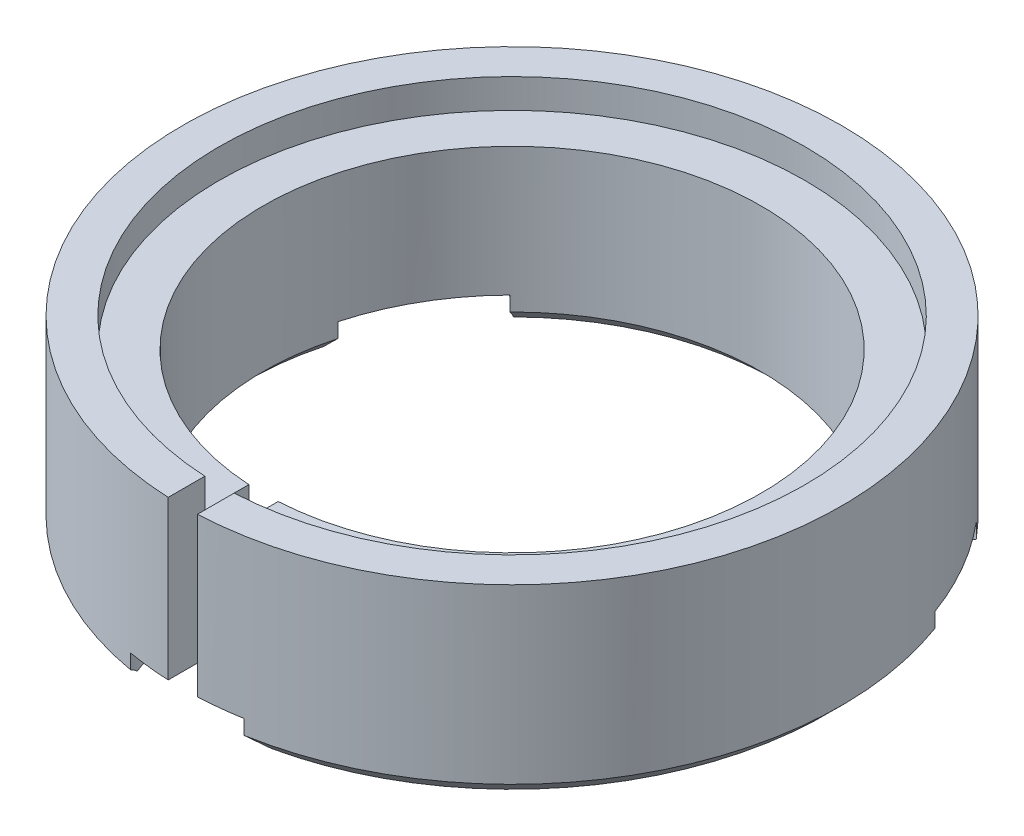
ISO-10303-21;
HEADER;
FILE_DESCRIPTION(('STEP AP214'),'2;1');
FILE_NAME('part.step','',(''),(''),'','','');
FILE_SCHEMA(('AUTOMOTIVE_DESIGN { 1 0 10303 214 1 1 1 1 }'));
ENDSEC;
DATA;
#1=APPLICATION_CONTEXT('core data for automotive mechanical design processes');
#2=APPLICATION_PROTOCOL_DEFINITION('international standard','automotive_design',2000,#1);
#3=PRODUCT_CONTEXT('',#1,'mechanical');
#4=PRODUCT('Part','Part','',(#3));
#5=PRODUCT_RELATED_PRODUCT_CATEGORY('part','',(#4));
#6=PRODUCT_DEFINITION_FORMATION('','',#4);
#7=PRODUCT_DEFINITION_CONTEXT('part definition',#1,'design');
#8=PRODUCT_DEFINITION('design','',#6,#7);
#9=PRODUCT_DEFINITION_SHAPE('','',#8);
#10=(LENGTH_UNIT() NAMED_UNIT(*) SI_UNIT(.MILLI.,.METRE.));
#11=(NAMED_UNIT(*) PLANE_ANGLE_UNIT() SI_UNIT($,.RADIAN.));
#12=(NAMED_UNIT(*) SI_UNIT($,.STERADIAN.) SOLID_ANGLE_UNIT());
#13=UNCERTAINTY_MEASURE_WITH_UNIT(LENGTH_MEASURE(1.E-05),#10,'distance_accuracy_value','');
#14=(GEOMETRIC_REPRESENTATION_CONTEXT(3) GLOBAL_UNCERTAINTY_ASSIGNED_CONTEXT((#13)) GLOBAL_UNIT_ASSIGNED_CONTEXT((#10,
#11,#12)) REPRESENTATION_CONTEXT('',''));
#15=CARTESIAN_POINT('',(0.,0.,0.));
#16=DIRECTION('',(0.,0.,1.));
#17=DIRECTION('',(1.,0.,0.));
#18=AXIS2_PLACEMENT_3D('',#15,#16,#17);
#19=CARTESIAN_POINT('',(0.,1.,9.5));
#20=DIRECTION('',(0.,-1.,0.));
#21=DIRECTION('',(0.,0.,-1.));
#22=AXIS2_PLACEMENT_3D('',#19,#20,#21);
#23=PLANE('',#22);
#24=DIRECTION('',(0.,0.,1.));
#25=VECTOR('',#24,1.);
#26=CARTESIAN_POINT('',(0.499999999999999,1.,9.5));
#27=LINE('',#26,#25);
#28=CARTESIAN_POINT('',(0.5,1.,8.48528137423857));
#29=VERTEX_POINT('',#28);
#30=CARTESIAN_POINT('',(0.499999999999999,1.,11.2388833964945));
#31=VERTEX_POINT('',#30);
#32=EDGE_CURVE('E11',#29,#31,#27,.T.);
#33=ORIENTED_EDGE('',*,*,#32,.F.);
#34=CARTESIAN_POINT('',(0.,1.,0.));
#35=DIRECTION('',(0.,-1.,0.));
#36=DIRECTION('',(0.,0.,-1.));
#37=AXIS2_PLACEMENT_3D('',#34,#35,#36);
#38=CIRCLE('',#37,8.5);
#39=CARTESIAN_POINT('',(2.14965532249711,1.,8.22368421052632));
#40=VERTEX_POINT('',#39);
#41=EDGE_CURVE('E227',#40,#29,#38,.T.);
#42=ORIENTED_EDGE('',*,*,#41,.F.);
#43=CARTESIAN_POINT('',(0.,1.,9.5));
#44=DIRECTION('',(0.,-1.,0.));
#45=DIRECTION('',(0.,0.,-1.));
#46=AXIS2_PLACEMENT_3D('',#43,#44,#45);
#47=CIRCLE('',#46,2.5);
#48=CARTESIAN_POINT('',(1.93559463098159,1.,11.0822368421053));
#49=VERTEX_POINT('',#48);
#50=EDGE_CURVE('E414',#40,#49,#47,.T.);
#51=ORIENTED_EDGE('',*,*,#50,.T.);
#52=CARTESIAN_POINT('',(0.,1.,0.));
#53=DIRECTION('',(0.,-1.,0.));
#54=DIRECTION('',(0.,0.,-1.));
#55=AXIS2_PLACEMENT_3D('',#52,#53,#54);
#56=CIRCLE('',#55,11.25);
#57=EDGE_CURVE('E209',#49,#31,#56,.T.);
#58=ORIENTED_EDGE('',*,*,#57,.T.);
#59=EDGE_LOOP('',(#33,#42,#51,#58));
#60=FACE_BOUND('',#59,.T.);
#61=ADVANCED_FACE('F41',(#60),#23,.T.);
#62=CARTESIAN_POINT('',(0.,0.,0.));
#63=DIRECTION('',(0.,1.,0.));
#64=DIRECTION('',(0.,0.,1.));
#65=AXIS2_PLACEMENT_3D('',#62,#63,#64);
#66=PLANE('',#65);
#67=CARTESIAN_POINT('',(0.,0.,0.));
#68=DIRECTION('',(0.,1.,0.));
#69=DIRECTION('',(0.,0.,1.));
#70=AXIS2_PLACEMENT_3D('',#67,#68,#69);
#71=CIRCLE('',#70,10.75);
#72=CARTESIAN_POINT('',(10.2410402028519,0.,-3.26857699367349));
#73=VERTEX_POINT('',#72);
#74=CARTESIAN_POINT('',(2.28984939067932,0.,10.5032894736842));
#75=VERTEX_POINT('',#74);
#76=EDGE_CURVE('E250',#73,#75,#71,.F.);
#77=ORIENTED_EDGE('',*,*,#76,.T.);
#78=CARTESIAN_POINT('',(0.,0.,9.5));
#79=DIRECTION('',(0.,-1.,0.));
#80=DIRECTION('',(0.,0.,-1.));
#81=AXIS2_PLACEMENT_3D('',#78,#79,#80);
#82=CIRCLE('',#81,2.5);
#83=CARTESIAN_POINT('',(2.36315203375196,0.,8.68421052631579));
#84=VERTEX_POINT('',#83);
#85=EDGE_CURVE('E415',#84,#75,#82,.T.);
#86=ORIENTED_EDGE('',*,*,#85,.F.);
#87=CARTESIAN_POINT('',(0.,0.,0.));
#88=DIRECTION('',(0.,1.,0.));
#89=DIRECTION('',(0.,0.,1.));
#90=AXIS2_PLACEMENT_3D('',#87,#88,#89);
#91=CIRCLE('',#90,9.);
#92=CARTESIAN_POINT('',(8.70232294447769,0.,-2.29555556892383));
#93=VERTEX_POINT('',#92);
#94=EDGE_CURVE('E259',#84,#93,#91,.T.);
#95=ORIENTED_EDGE('',*,*,#94,.T.);
#96=CARTESIAN_POINT('',(8.22724133595217,0.,-4.75));
#97=DIRECTION('',(0.,-1.,0.));
#98=DIRECTION('',(0.,0.,-1.));
#99=AXIS2_PLACEMENT_3D('',#96,#97,#98);
#100=CIRCLE('',#99,2.5);
#101=EDGE_CURVE('E530',#73,#93,#100,.T.);
#102=ORIENTED_EDGE('',*,*,#101,.F.);
#103=EDGE_LOOP('',(#77,#86,#95,#102));
#104=FACE_BOUND('',#103,.T.);
#105=ADVANCED_FACE('F497',(#104),#66,.F.);
#106=CARTESIAN_POINT('',(-8.70232294447769,0.,-2.29555556892384));
#107=VERTEX_POINT('',#106);
#108=CARTESIAN_POINT('',(-2.36315203375196,0.,8.68421052631579));
#109=VERTEX_POINT('',#108);
#110=EDGE_CURVE('E257',#107,#109,#91,.T.);
#111=ORIENTED_EDGE('',*,*,#110,.T.);
#112=CARTESIAN_POINT('',(-2.28984939067932,0.,10.5032894736842));
#113=VERTEX_POINT('',#112);
#114=EDGE_CURVE('E501',#113,#109,#82,.T.);
#115=ORIENTED_EDGE('',*,*,#114,.F.);
#116=CARTESIAN_POINT('',(-10.2410402028519,0.,-3.2685769936735));
#117=VERTEX_POINT('',#116);
#118=EDGE_CURVE('E253',#113,#117,#71,.F.);
#119=ORIENTED_EDGE('',*,*,#118,.T.);
#120=CARTESIAN_POINT('',(-8.22724133595217,0.,-4.75));
#121=DIRECTION('',(0.,-1.,0.));
#122=DIRECTION('',(0.,0.,-1.));
#123=AXIS2_PLACEMENT_3D('',#120,#121,#122);
#124=CIRCLE('',#123,2.5);
#125=EDGE_CURVE('E518',#107,#117,#124,.T.);
#126=ORIENTED_EDGE('',*,*,#125,.F.);
#127=EDGE_LOOP('',(#111,#115,#119,#126));
#128=FACE_BOUND('',#127,.T.);
#129=ADVANCED_FACE('F516',(#128),#66,.F.);
#130=CARTESIAN_POINT('',(0.,0.,0.));
#131=DIRECTION('',(0.,-1.,0.));
#132=DIRECTION('',(0.,0.,-1.));
#133=AXIS2_PLACEMENT_3D('',#130,#131,#132);
#134=CONICAL_SURFACE('',#133,9.,0.785398163397448);
#135=CARTESIAN_POINT('',(2.14954906717412,0.500199999999998,8.22350526526316));
#136=CARTESIAN_POINT('',(2.17145898814972,0.458959400279768,8.26040325379449));
#137=CARTESIAN_POINT('',(2.19233726922731,0.417549813046499,8.2977222303353));
#138=CARTESIAN_POINT('',(2.23201727389722,0.334519887866781,8.37309618021764));
#139=CARTESIAN_POINT('',(2.25082173302116,0.292899905159152,8.4111501042705));
#140=CARTESIAN_POINT('',(2.28639908039597,0.209466300408049,8.48798643267669));
#141=CARTESIAN_POINT('',(2.30317198835465,0.167652680247113,8.52676882995898));
#142=CARTESIAN_POINT('',(2.33470964035825,0.0838377376101247,8.60506254854352));
#143=CARTESIAN_POINT('',(2.34947166949939,0.0418362389205898,8.64457477509277));
#144=CARTESIAN_POINT('',(2.36321743465008,-0.000200000000000804,8.68440000210526));
#145=B_SPLINE_CURVE_WITH_KNOTS('',3,(#135,#136,#137,#138,#139,#140,#141,#142,#143,#144),
.UNSPECIFIED.,.F.,.F.,(4,2,2,2,4),(0.,0.178538378129554,0.356838360064525,0.535136612196156,
0.713673249603022),.UNSPECIFIED.);
#146=CARTESIAN_POINT('',(2.14965532249711,0.499999999999998,8.22368421052632));
#147=VERTEX_POINT('',#146);
#148=EDGE_CURVE('E478',#147,#84,#145,.T.);
#149=ORIENTED_EDGE('',*,*,#148,.F.);
#150=CARTESIAN_POINT('',(0.,0.499999999999999,0.));
#151=DIRECTION('',(0.,1.,0.));
#152=DIRECTION('',(0.,0.,1.));
#153=AXIS2_PLACEMENT_3D('',#150,#151,#152);
#154=CIRCLE('',#153,8.5);
#155=CARTESIAN_POINT('',(8.19674710026533,0.499999999999998,-2.25018598660022));
#156=VERTEX_POINT('',#155);
#157=EDGE_CURVE('E263',#156,#147,#154,.F.);
#158=ORIENTED_EDGE('',*,*,#157,.F.);
#159=CARTESIAN_POINT('',(8.70251973577383,-0.000200000000000274,-2.29559366797937));
#160=CARTESIAN_POINT('',(8.66115719489422,0.0418362389205633,-2.28758523628808));
#161=CARTESIAN_POINT('',(8.61955758837193,0.0838377376100716,-2.28061341526109));
#162=CARTESIAN_POINT('',(8.53598441311922,0.167652680247006,-2.26877896377965));
#163=CARTESIAN_POINT('',(8.49401141787379,0.209466300407915,-2.26391352952606));
#164=CARTESIAN_POINT('',(8.40968053185316,0.292899905158964,-2.25630625194882));
#165=CARTESIAN_POINT('',(8.36732263734775,0.334519887866567,-2.25356442922815));
#166=CARTESIAN_POINT('',(8.28220687963117,0.417549813046232,-2.2502413463534));
#167=CARTESIAN_POINT('',(8.23944855736483,0.458959400279475,-2.24966297988354));
#168=CARTESIAN_POINT('',(8.19653900146038,0.50019999999968,-2.25018853377764));
#169=B_SPLINE_CURVE_WITH_KNOTS('',3,(#159,#160,#161,#162,#163,#164,#165,#166,#167,#168),
.UNSPECIFIED.,.F.,.F.,(4,2,2,2,4),(0.,0.178536637406754,0.356834889538269,0.535134871473124,
0.713673249602564),.UNSPECIFIED.);
#170=EDGE_CURVE('E342',#93,#156,#169,.T.);
#171=ORIENTED_EDGE('',*,*,#170,.F.);
#172=ORIENTED_EDGE('',*,*,#94,.F.);
#173=EDGE_LOOP('',(#149,#158,#171,#172));
#174=FACE_BOUND('',#173,.T.);
#175=ADVANCED_FACE('F325',(#174),#134,.F.);
#176=CARTESIAN_POINT('',(6.0469899342863,0.50019999999927,-5.97331673148617));
#177=CARTESIAN_POINT('',(6.06798956921516,0.458959400279099,-6.01074027391155));
#178=CARTESIAN_POINT('',(6.08986961040391,0.417549813045889,-6.04748088398244));
#179=CARTESIAN_POINT('',(6.13530536345059,0.334519887866291,-6.11953175098992));
#180=CARTESIAN_POINT('',(6.15885879883205,0.292899905158722,-6.15484385232205));
#181=CARTESIAN_POINT('',(6.20761233747786,0.209466300407741,-6.22407290315088));
#182=CARTESIAN_POINT('',(6.23281242476461,0.167652680246867,-6.25798986617953));
#183=CARTESIAN_POINT('',(6.28484794801371,0.083837737610002,-6.32444913328253));
#184=CARTESIAN_POINT('',(6.31168552539484,0.0418362389205291,-6.35698953880475));
#185=CARTESIAN_POINT('',(6.33930230112375,-0.000199999999999805,-6.38880633412589));
#186=B_SPLINE_CURVE_WITH_KNOTS('',3,(#176,#177,#178,#179,#180,#181,#182,#183,#184,#185),
.UNSPECIFIED.,.F.,.F.,(4,2,2,2,4),(0.,0.178538378129292,0.356838360063999,0.535136612195368,
0.713673249601971),.UNSPECIFIED.);
#187=CARTESIAN_POINT('',(6.04709177776821,0.499999999999999,-5.97349822392609));
#188=VERTEX_POINT('',#187);
#189=CARTESIAN_POINT('',(6.33917091072572,0.,-6.38865495739196));
#190=VERTEX_POINT('',#189);
#191=EDGE_CURVE('E350',#188,#190,#186,.T.);
#192=ORIENTED_EDGE('',*,*,#191,.F.);
#193=CARTESIAN_POINT('',(-6.04709177776821,0.499999999999999,-5.97349822392609));
#194=VERTEX_POINT('',#193);
#195=EDGE_CURVE('E270',#194,#188,#154,.F.);
#196=ORIENTED_EDGE('',*,*,#195,.F.);
#197=CARTESIAN_POINT('',(-6.33930230112375,-0.000200000000000267,-6.38880633412589));
#198=CARTESIAN_POINT('',(-6.31168552539483,0.0418362389205288,-6.35698953880475));
#199=CARTESIAN_POINT('',(-6.2848479480137,0.0838377376100018,-6.32444913328254));
#200=CARTESIAN_POINT('',(-6.23281242476461,0.167652680246867,-6.25798986617954));
#201=CARTESIAN_POINT('',(-6.20761233747786,0.209466300407741,-6.22407290315089));
#202=CARTESIAN_POINT('',(-6.15885879883205,0.292899905158722,-6.15484385232206));
#203=CARTESIAN_POINT('',(-6.13530536345059,0.334519887866291,-6.11953175098992));
#204=CARTESIAN_POINT('',(-6.08986961040391,0.41754981304589,-6.04748088398245));
#205=CARTESIAN_POINT('',(-6.06798956921515,0.458959400279099,-6.01074027391155));
#206=CARTESIAN_POINT('',(-6.04698993428629,0.50019999999927,-5.97331673148617));
#207=B_SPLINE_CURVE_WITH_KNOTS('',3,(#197,#198,#199,#200,#201,#202,#203,#204,#205,#206),
.UNSPECIFIED.,.F.,.F.,(4,2,2,2,4),(0.,0.178536637406603,0.356834889537972,0.535134871472679,
0.713673249601971),.UNSPECIFIED.);
#208=CARTESIAN_POINT('',(-6.33917091072572,0.,-6.38865495739196));
#209=VERTEX_POINT('',#208);
#210=EDGE_CURVE('E306',#209,#194,#207,.T.);
#211=ORIENTED_EDGE('',*,*,#210,.F.);
#212=EDGE_CURVE('E264',#190,#209,#91,.T.);
#213=ORIENTED_EDGE('',*,*,#212,.F.);
#214=EDGE_LOOP('',(#192,#196,#211,#213));
#215=FACE_BOUND('',#214,.T.);
#216=ADVANCED_FACE('F326',(#215),#134,.F.);
#217=CARTESIAN_POINT('',(0.,0.499999999999999,0.));
#218=DIRECTION('',(0.,1.,0.));
#219=DIRECTION('',(0.,0.,1.));
#220=AXIS2_PLACEMENT_3D('',#217,#218,#219);
#221=CONICAL_SURFACE('',#220,11.25,0.785398163397452);
#222=CARTESIAN_POINT('',(-1.93540100034027,0.500199999999999,11.0824736863158));
#223=CARTESIAN_POINT('',(-1.97281692724771,0.461557722741419,11.0367109885504));
#224=CARTESIAN_POINT('',(-2.00822089819441,0.421999403136975,10.9901018009973));
#225=CARTESIAN_POINT('',(-2.07496328265597,0.34139780101778,10.8956575411624));
#226=CARTESIAN_POINT('',(-2.10631602010078,0.300360445287688,10.8478275463479));
#227=CARTESIAN_POINT('',(-2.16518252982319,0.216867772169137,10.7510760952157));
#228=CARTESIAN_POINT('',(-2.19269667046307,0.174412591324326,10.7021547441508));
#229=CARTESIAN_POINT('',(-2.24407789271844,0.0880904357553623,10.6032804647119));
#230=CARTESIAN_POINT('',(-2.26793129106946,0.0442188721776409,10.5533244219692));
#231=CARTESIAN_POINT('',(-2.28994853589569,-0.000200000000000116,10.50306316));
#232=B_SPLINE_CURVE_WITH_KNOTS('',3,(#222,#223,#224,#225,#226,#227,#228,#229,#230,#231),
.UNSPECIFIED.,.F.,.F.,(4,2,2,2,4),(0.,0.211801767572328,0.422832888787811,0.633843744928348,
0.845625061693787),.UNSPECIFIED.);
#233=CARTESIAN_POINT('',(-1.93559463098159,0.499999999999998,11.0822368421053));
#234=VERTEX_POINT('',#233);
#235=EDGE_CURVE('E389',#234,#113,#232,.T.);
#236=ORIENTED_EDGE('',*,*,#235,.F.);
#237=CARTESIAN_POINT('',(0.,0.499999999999999,0.));
#238=DIRECTION('',(0.,1.,0.));
#239=DIRECTION('',(0.,0.,1.));
#240=AXIS2_PLACEMENT_3D('',#237,#238,#239);
#241=CIRCLE('',#240,11.25);
#242=CARTESIAN_POINT('',(-10.5652959515098,0.499999999999998,-3.86484429919381));
#243=VERTEX_POINT('',#242);
#244=EDGE_CURVE('E269',#243,#234,#241,.T.);
#245=ORIENTED_EDGE('',*,*,#244,.F.);
#246=CARTESIAN_POINT('',(-10.2408937820603,-0.000200000000000201,-3.26837797455535));
#247=CARTESIAN_POINT('',(-10.2734126893388,0.0442188721776214,-3.31257609888078));
#248=CARTESIAN_POINT('',(-10.3047491922509,0.0880904357553244,-3.35821176919067));
#249=CARTESIAN_POINT('',(-10.3646862188982,0.174412591324252,-3.45214635266075));
#250=CARTESIAN_POINT('',(-10.3932962813879,0.216867772169047,-3.50043497295059));
#251=CARTESIAN_POINT('',(-10.4476522410602,0.300360445287565,-3.5997905913684));
#252=CARTESIAN_POINT('',(-10.47339786291,0.34139780101764,-3.65085785588101));
#253=CARTESIAN_POINT('',(-10.5218177989379,0.421999403136804,-3.75588058625129));
#254=CARTESIAN_POINT('',(-10.5444805539352,0.461557722741233,-3.80984591826246));
#255=CARTESIAN_POINT('',(-10.5654042492921,0.5001999999998,-3.86513041035313));
#256=B_SPLINE_CURVE_WITH_KNOTS('',3,(#246,#247,#248,#249,#250,#251,#252,#253,#254,#255),
.UNSPECIFIED.,.F.,.F.,(4,2,2,2,4),(0.,0.211781316765348,0.422792172905795,0.633823294121187,
0.845625061693423),.UNSPECIFIED.);
#257=EDGE_CURVE('E275',#117,#243,#256,.T.);
#258=ORIENTED_EDGE('',*,*,#257,.F.);
#259=ORIENTED_EDGE('',*,*,#118,.F.);
#260=EDGE_LOOP('',(#236,#245,#258,#259));
#261=FACE_BOUND('',#260,.T.);
#262=ADVANCED_FACE('F566',(#261),#221,.T.);
#263=CARTESIAN_POINT('',(2.28994853589569,-0.000200000000000289,10.50306316));
#264=CARTESIAN_POINT('',(2.26793129106946,0.0442188721776414,10.5533244219692));
#265=CARTESIAN_POINT('',(2.24407789271844,0.0880904357553632,10.6032804647119));
#266=CARTESIAN_POINT('',(2.19269667046307,0.174412591324327,10.7021547441508));
#267=CARTESIAN_POINT('',(2.16518252982319,0.216867772169137,10.7510760952157));
#268=CARTESIAN_POINT('',(2.10631602010078,0.300360445287688,10.8478275463479));
#269=CARTESIAN_POINT('',(2.07496328265597,0.34139780101778,10.8956575411624));
#270=CARTESIAN_POINT('',(2.00822089819441,0.421999403136975,10.9901018009973));
#271=CARTESIAN_POINT('',(1.97281692724771,0.461557722741419,11.0367109885504));
#272=CARTESIAN_POINT('',(1.93540100034027,0.500199999999998,11.0824736863158));
#273=B_SPLINE_CURVE_WITH_KNOTS('',3,(#263,#264,#265,#266,#267,#268,#269,#270,#271,#272),
.UNSPECIFIED.,.F.,.F.,(4,2,2,2,4),(0.,0.211781316765441,0.422792172905977,0.633823294121458,
0.845625061693787),.UNSPECIFIED.);
#274=CARTESIAN_POINT('',(1.93559463098159,0.499999999999999,11.0822368421053));
#275=VERTEX_POINT('',#274);
#276=EDGE_CURVE('E381',#75,#275,#273,.T.);
#277=ORIENTED_EDGE('',*,*,#276,.F.);
#278=ORIENTED_EDGE('',*,*,#76,.F.);
#279=CARTESIAN_POINT('',(10.5654042492921,0.500199999999799,-3.86513041035312));
#280=CARTESIAN_POINT('',(10.5444805539352,0.461557722741233,-3.80984591826244));
#281=CARTESIAN_POINT('',(10.5218177989379,0.421999403136804,-3.75588058625127));
#282=CARTESIAN_POINT('',(10.47339786291,0.341397801017639,-3.650857855881));
#283=CARTESIAN_POINT('',(10.4476522410602,0.300360445287563,-3.59979059136839));
#284=CARTESIAN_POINT('',(10.3932962813879,0.216867772169045,-3.50043497295058));
#285=CARTESIAN_POINT('',(10.3646862188982,0.174412591324252,-3.45214635266074));
#286=CARTESIAN_POINT('',(10.3047491922509,0.0880904357553243,-3.35821176919066));
#287=CARTESIAN_POINT('',(10.2734126893388,0.0442188721776214,-3.31257609888077));
#288=CARTESIAN_POINT('',(10.2408937820603,-0.000200000000000632,-3.26837797455534));
#289=B_SPLINE_CURVE_WITH_KNOTS('',3,(#279,#280,#281,#282,#283,#284,#285,#286,#287,#288),
.UNSPECIFIED.,.F.,.F.,(4,2,2,2,4),(0.,0.211801767572237,0.422832888787628,0.633843744928073,
0.845625061693422),.UNSPECIFIED.);
#290=CARTESIAN_POINT('',(10.5652959515098,0.499999999999999,-3.8648442991938));
#291=VERTEX_POINT('',#290);
#292=EDGE_CURVE('E579',#291,#73,#289,.T.);
#293=ORIENTED_EDGE('',*,*,#292,.F.);
#294=EDGE_CURVE('E271',#275,#291,#241,.T.);
#295=ORIENTED_EDGE('',*,*,#294,.F.);
#296=EDGE_LOOP('',(#277,#278,#293,#295));
#297=FACE_BOUND('',#296,.T.);
#298=ADVANCED_FACE('F710',(#297),#221,.T.);
#299=CARTESIAN_POINT('',(0.,6.4,0.));
#300=DIRECTION('',(0.,-1.,0.));
#301=DIRECTION('',(0.,0.,-1.));
#302=AXIS2_PLACEMENT_3D('',#299,#300,#301);
#303=CYLINDRICAL_SURFACE('',#302,8.5);
#304=DIRECTION('',(0.,-1.,0.));
#305=VECTOR('',#304,1.);
#306=CARTESIAN_POINT('',(0.5,6.4,8.48528137423857));
#307=LINE('',#306,#305);
#308=CARTESIAN_POINT('',(0.5,5.4,8.48528137423857));
#309=VERTEX_POINT('',#308);
#310=EDGE_CURVE('E58',#309,#29,#307,.T.);
#311=ORIENTED_EDGE('',*,*,#310,.F.);
#312=CARTESIAN_POINT('',(0.,5.4,0.));
#313=DIRECTION('',(0.,1.,0.));
#314=DIRECTION('',(0.,0.,1.));
#315=AXIS2_PLACEMENT_3D('',#312,#313,#314);
#316=CIRCLE('',#315,8.5);
#317=CARTESIAN_POINT('',(-0.500000000000002,5.4,8.48528137423857));
#318=VERTEX_POINT('',#317);
#319=EDGE_CURVE('E217',#309,#318,#316,.T.);
#320=ORIENTED_EDGE('',*,*,#319,.T.);
#321=DIRECTION('',(0.,-1.,0.));
#322=VECTOR('',#321,1.);
#323=CARTESIAN_POINT('',(-0.500000000000002,6.4,8.48528137423857));
#324=LINE('',#323,#322);
#325=CARTESIAN_POINT('',(-0.500000000000002,1.,8.48528137423857));
#326=VERTEX_POINT('',#325);
#327=EDGE_CURVE('E203',#326,#318,#324,.F.);
#328=ORIENTED_EDGE('',*,*,#327,.F.);
#329=CARTESIAN_POINT('',(-2.14965532249711,1.,8.22368421052632));
#330=VERTEX_POINT('',#329);
#331=EDGE_CURVE('E214',#326,#330,#38,.T.);
#332=ORIENTED_EDGE('',*,*,#331,.T.);
#333=DIRECTION('',(0.,-1.,0.));
#334=VECTOR('',#333,1.);
#335=CARTESIAN_POINT('',(-2.14965532249711,0.5,8.22368421052632));
#336=LINE('',#335,#334);
#337=CARTESIAN_POINT('',(-2.14965532249711,0.499999999999998,8.22368421052632));
#338=VERTEX_POINT('',#337);
#339=EDGE_CURVE('E366',#338,#330,#336,.F.);
#340=ORIENTED_EDGE('',*,*,#339,.F.);
#341=CARTESIAN_POINT('',(-8.19674710026532,0.499999999999999,-2.25018598660023));
#342=VERTEX_POINT('',#341);
#343=EDGE_CURVE('E265',#338,#342,#154,.F.);
#344=ORIENTED_EDGE('',*,*,#343,.T.);
#345=DIRECTION('',(0.,-1.,0.));
#346=VECTOR('',#345,1.);
#347=CARTESIAN_POINT('',(-8.19674710026532,0.5,-2.25018598660023));
#348=LINE('',#347,#346);
#349=CARTESIAN_POINT('',(-8.19674710026532,1.,-2.25018598660023));
#350=VERTEX_POINT('',#349);
#351=EDGE_CURVE('E449',#350,#342,#348,.T.);
#352=ORIENTED_EDGE('',*,*,#351,.F.);
#353=CARTESIAN_POINT('',(0.,1.,0.));
#354=DIRECTION('',(0.,-1.,0.));
#355=DIRECTION('',(0.,0.,-1.));
#356=AXIS2_PLACEMENT_3D('',#353,#354,#355);
#357=CIRCLE('',#356,8.5);
#358=CARTESIAN_POINT('',(-6.04709177776821,1.,-5.97349822392609));
#359=VERTEX_POINT('',#358);
#360=EDGE_CURVE('E235',#350,#359,#357,.T.);
#361=ORIENTED_EDGE('',*,*,#360,.T.);
#362=DIRECTION('',(0.,-1.,0.));
#363=VECTOR('',#362,1.);
#364=CARTESIAN_POINT('',(-6.04709177776821,0.5,-5.97349822392609));
#365=LINE('',#364,#363);
#366=EDGE_CURVE('E314',#194,#359,#365,.F.);
#367=ORIENTED_EDGE('',*,*,#366,.F.);
#368=ORIENTED_EDGE('',*,*,#195,.T.);
#369=DIRECTION('',(0.,-1.,0.));
#370=VECTOR('',#369,1.);
#371=CARTESIAN_POINT('',(6.04709177776821,0.5,-5.97349822392609));
#372=LINE('',#371,#370);
#373=CARTESIAN_POINT('',(6.04709177776821,1.,-5.97349822392609));
#374=VERTEX_POINT('',#373);
#375=EDGE_CURVE('E425',#374,#188,#372,.T.);
#376=ORIENTED_EDGE('',*,*,#375,.F.);
#377=CARTESIAN_POINT('',(0.,1.,0.));
#378=DIRECTION('',(0.,-1.,0.));
#379=DIRECTION('',(0.,0.,-1.));
#380=AXIS2_PLACEMENT_3D('',#377,#378,#379);
#381=CIRCLE('',#380,8.5);
#382=CARTESIAN_POINT('',(8.19674710026533,1.,-2.25018598660022));
#383=VERTEX_POINT('',#382);
#384=EDGE_CURVE('E228',#374,#383,#381,.T.);
#385=ORIENTED_EDGE('',*,*,#384,.T.);
#386=DIRECTION('',(0.,-1.,0.));
#387=VECTOR('',#386,1.);
#388=CARTESIAN_POINT('',(8.19674710026532,0.5,-2.25018598660022));
#389=LINE('',#388,#387);
#390=EDGE_CURVE('E433',#156,#383,#389,.F.);
#391=ORIENTED_EDGE('',*,*,#390,.F.);
#392=ORIENTED_EDGE('',*,*,#157,.T.);
#393=DIRECTION('',(0.,-1.,0.));
#394=VECTOR('',#393,1.);
#395=CARTESIAN_POINT('',(2.14965532249711,0.5,8.22368421052632));
#396=LINE('',#395,#394);
#397=EDGE_CURVE('E476',#40,#147,#396,.T.);
#398=ORIENTED_EDGE('',*,*,#397,.F.);
#399=ORIENTED_EDGE('',*,*,#41,.T.);
#400=EDGE_LOOP('',(#311,#320,#328,#332,#340,#344,#352,#361,#367,#368,#376,#385,#391,#392,#398,#399));
#401=FACE_BOUND('',#400,.T.);
#402=ADVANCED_FACE('F212',(#401),#303,.F.);
#403=CARTESIAN_POINT('',(0.,6.4,0.));
#404=DIRECTION('',(0.,1.,0.));
#405=DIRECTION('',(0.,0.,1.));
#406=AXIS2_PLACEMENT_3D('',#403,#404,#405);
#407=PLANE('',#406);
#408=DIRECTION('',(0.,0.,-1.));
#409=VECTOR('',#408,1.);
#410=CARTESIAN_POINT('',(0.500000000000002,6.4,0.));
#411=LINE('',#410,#409);
#412=CARTESIAN_POINT('',(0.499999999999999,6.4,11.2388833964945));
#413=VERTEX_POINT('',#412);
#414=CARTESIAN_POINT('',(0.499999999999999,6.4,9.98749217771909));
#415=VERTEX_POINT('',#414);
#416=EDGE_CURVE('E543',#413,#415,#411,.T.);
#417=ORIENTED_EDGE('',*,*,#416,.F.);
#418=CARTESIAN_POINT('',(0.,6.4,0.));
#419=DIRECTION('',(0.,1.,0.));
#420=DIRECTION('',(0.,0.,1.));
#421=AXIS2_PLACEMENT_3D('',#418,#419,#420);
#422=CIRCLE('',#421,11.25);
#423=CARTESIAN_POINT('',(-0.500000000000002,6.4,11.2388833964945));
#424=VERTEX_POINT('',#423);
#425=EDGE_CURVE('E246',#413,#424,#422,.T.);
#426=ORIENTED_EDGE('',*,*,#425,.T.);
#427=DIRECTION('',(0.,0.,1.));
#428=VECTOR('',#427,1.);
#429=CARTESIAN_POINT('',(-0.500000000000002,6.4,0.));
#430=LINE('',#429,#428);
#431=CARTESIAN_POINT('',(-0.500000000000002,6.4,9.98749217771909));
#432=VERTEX_POINT('',#431);
#433=EDGE_CURVE('E220',#432,#424,#430,.T.);
#434=ORIENTED_EDGE('',*,*,#433,.F.);
#435=CARTESIAN_POINT('',(0.,6.4,0.));
#436=DIRECTION('',(0.,1.,0.));
#437=DIRECTION('',(0.,0.,1.));
#438=AXIS2_PLACEMENT_3D('',#435,#436,#437);
#439=CIRCLE('',#438,10.);
#440=EDGE_CURVE('E233',#415,#432,#439,.T.);
#441=ORIENTED_EDGE('',*,*,#440,.F.);
#442=EDGE_LOOP('',(#417,#426,#434,#441));
#443=FACE_BOUND('',#442,.T.);
#444=ADVANCED_FACE('F748',(#443),#407,.T.);
#445=CARTESIAN_POINT('',(-7.95119081217255,0.,-7.23471248001072));
#446=VERTEX_POINT('',#445);
#447=CARTESIAN_POINT('',(7.95119081217255,0.,-7.23471248001071));
#448=VERTEX_POINT('',#447);
#449=EDGE_CURVE('E258',#446,#448,#71,.F.);
#450=ORIENTED_EDGE('',*,*,#449,.T.);
#451=EDGE_CURVE('E532',#190,#448,#100,.T.);
#452=ORIENTED_EDGE('',*,*,#451,.F.);
#453=ORIENTED_EDGE('',*,*,#212,.T.);
#454=EDGE_CURVE('E473',#446,#209,#124,.T.);
#455=ORIENTED_EDGE('',*,*,#454,.F.);
#456=EDGE_LOOP('',(#450,#452,#453,#455));
#457=FACE_BOUND('',#456,.T.);
#458=ADVANCED_FACE('F605',(#457),#66,.F.);
#459=CARTESIAN_POINT('',(0.,6.4,0.));
#460=DIRECTION('',(0.,-1.,0.));
#461=DIRECTION('',(0.,0.,-1.));
#462=AXIS2_PLACEMENT_3D('',#459,#460,#461);
#463=CYLINDRICAL_SURFACE('',#462,11.25);
#464=ORIENTED_EDGE('',*,*,#425,.F.);
#465=DIRECTION('',(0.,-1.,0.));
#466=VECTOR('',#465,1.);
#467=CARTESIAN_POINT('',(0.499999999999999,6.4,11.2388833964945));
#468=LINE('',#467,#466);
#469=EDGE_CURVE('E540',#413,#31,#468,.T.);
#470=ORIENTED_EDGE('',*,*,#469,.T.);
#471=ORIENTED_EDGE('',*,*,#57,.F.);
#472=DIRECTION('',(0.,-1.,0.));
#473=VECTOR('',#472,1.);
#474=CARTESIAN_POINT('',(1.93559463098159,0.5,11.0822368421053));
#475=LINE('',#474,#473);
#476=EDGE_CURVE('E422',#49,#275,#475,.T.);
#477=ORIENTED_EDGE('',*,*,#476,.T.);
#478=ORIENTED_EDGE('',*,*,#294,.T.);
#479=DIRECTION('',(0.,-1.,0.));
#480=VECTOR('',#479,1.);
#481=CARTESIAN_POINT('',(10.5652959515098,0.5,-3.86484429919381));
#482=LINE('',#481,#480);
#483=CARTESIAN_POINT('',(10.5652959515098,1.,-3.8648442991938));
#484=VERTEX_POINT('',#483);
#485=EDGE_CURVE('E441',#291,#484,#482,.F.);
#486=ORIENTED_EDGE('',*,*,#485,.T.);
#487=CARTESIAN_POINT('',(0.,1.,0.));
#488=DIRECTION('',(0.,-1.,0.));
#489=DIRECTION('',(0.,0.,-1.));
#490=AXIS2_PLACEMENT_3D('',#487,#488,#489);
#491=CIRCLE('',#490,11.25);
#492=CARTESIAN_POINT('',(8.6297013205282,1.,-7.21739254291146));
#493=VERTEX_POINT('',#492);
#494=EDGE_CURVE('E399',#493,#484,#491,.T.);
#495=ORIENTED_EDGE('',*,*,#494,.F.);
#496=DIRECTION('',(0.,-1.,0.));
#497=VECTOR('',#496,1.);
#498=CARTESIAN_POINT('',(8.6297013205282,0.5,-7.21739254291146));
#499=LINE('',#498,#497);
#500=CARTESIAN_POINT('',(8.6297013205282,0.499999999999999,-7.21739254291146));
#501=VERTEX_POINT('',#500);
#502=EDGE_CURVE('E445',#493,#501,#499,.T.);
#503=ORIENTED_EDGE('',*,*,#502,.T.);
#504=CARTESIAN_POINT('',(-8.6297013205282,0.499999999999999,-7.21739254291146));
#505=VERTEX_POINT('',#504);
#506=EDGE_CURVE('E276',#501,#505,#241,.T.);
#507=ORIENTED_EDGE('',*,*,#506,.T.);
#508=DIRECTION('',(0.,-1.,0.));
#509=VECTOR('',#508,1.);
#510=CARTESIAN_POINT('',(-8.6297013205282,0.5,-7.21739254291146));
#511=LINE('',#510,#509);
#512=CARTESIAN_POINT('',(-8.6297013205282,1.,-7.21739254291146));
#513=VERTEX_POINT('',#512);
#514=EDGE_CURVE('E315',#505,#513,#511,.F.);
#515=ORIENTED_EDGE('',*,*,#514,.T.);
#516=CARTESIAN_POINT('',(0.,1.,0.));
#517=DIRECTION('',(0.,-1.,0.));
#518=DIRECTION('',(0.,0.,-1.));
#519=AXIS2_PLACEMENT_3D('',#516,#517,#518);
#520=CIRCLE('',#519,11.25);
#521=CARTESIAN_POINT('',(-10.5652959515098,1.,-3.86484429919381));
#522=VERTEX_POINT('',#521);
#523=EDGE_CURVE('E396',#522,#513,#520,.T.);
#524=ORIENTED_EDGE('',*,*,#523,.F.);
#525=DIRECTION('',(0.,-1.,0.));
#526=VECTOR('',#525,1.);
#527=CARTESIAN_POINT('',(-10.5652959515098,0.5,-3.86484429919382));
#528=LINE('',#527,#526);
#529=EDGE_CURVE('E535',#522,#243,#528,.T.);
#530=ORIENTED_EDGE('',*,*,#529,.T.);
#531=ORIENTED_EDGE('',*,*,#244,.T.);
#532=DIRECTION('',(0.,-1.,0.));
#533=VECTOR('',#532,1.);
#534=CARTESIAN_POINT('',(-1.93559463098159,0.5,11.0822368421053));
#535=LINE('',#534,#533);
#536=CARTESIAN_POINT('',(-1.93559463098159,1.,11.0822368421053));
#537=VERTEX_POINT('',#536);
#538=EDGE_CURVE('E367',#234,#537,#535,.F.);
#539=ORIENTED_EDGE('',*,*,#538,.T.);
#540=CARTESIAN_POINT('',(-0.500000000000002,1.,11.2388833964945));
#541=VERTEX_POINT('',#540);
#542=EDGE_CURVE('E402',#541,#537,#56,.T.);
#543=ORIENTED_EDGE('',*,*,#542,.F.);
#544=DIRECTION('',(0.,-1.,0.));
#545=VECTOR('',#544,1.);
#546=CARTESIAN_POINT('',(-0.500000000000002,6.4,11.2388833964945));
#547=LINE('',#546,#545);
#548=EDGE_CURVE('E66',#541,#424,#547,.F.);
#549=ORIENTED_EDGE('',*,*,#548,.T.);
#550=EDGE_LOOP('',(#464,#470,#471,#477,#478,#486,#495,#503,#507,#515,#524,#530,#531,#539,#543,#549));
#551=FACE_BOUND('',#550,.T.);
#552=ADVANCED_FACE('F327',(#551),#463,.T.);
#553=CARTESIAN_POINT('',(0.,5.4,0.));
#554=DIRECTION('',(0.,1.,0.));
#555=DIRECTION('',(0.,0.,1.));
#556=AXIS2_PLACEMENT_3D('',#553,#554,#555);
#557=CYLINDRICAL_SURFACE('',#556,10.);
#558=CARTESIAN_POINT('',(0.,5.4,0.));
#559=DIRECTION('',(0.,1.,0.));
#560=DIRECTION('',(0.,0.,1.));
#561=AXIS2_PLACEMENT_3D('',#558,#559,#560);
#562=CIRCLE('',#561,10.);
#563=CARTESIAN_POINT('',(0.499999999999999,5.4,9.98749217771909));
#564=VERTEX_POINT('',#563);
#565=CARTESIAN_POINT('',(-0.500000000000002,5.4,9.98749217771909));
#566=VERTEX_POINT('',#565);
#567=EDGE_CURVE('E239',#564,#566,#562,.T.);
#568=ORIENTED_EDGE('',*,*,#567,.F.);
#569=DIRECTION('',(0.,1.,0.));
#570=VECTOR('',#569,1.);
#571=CARTESIAN_POINT('',(0.499999999999999,5.4,9.98749217771909));
#572=LINE('',#571,#570);
#573=EDGE_CURVE('E557',#564,#415,#572,.T.);
#574=ORIENTED_EDGE('',*,*,#573,.T.);
#575=ORIENTED_EDGE('',*,*,#440,.T.);
#576=DIRECTION('',(0.,1.,0.));
#577=VECTOR('',#576,1.);
#578=CARTESIAN_POINT('',(-0.500000000000002,5.4,9.98749217771909));
#579=LINE('',#578,#577);
#580=EDGE_CURVE('E544',#432,#566,#579,.F.);
#581=ORIENTED_EDGE('',*,*,#580,.T.);
#582=EDGE_LOOP('',(#568,#574,#575,#581));
#583=FACE_BOUND('',#582,.T.);
#584=ADVANCED_FACE('F734',(#583),#557,.F.);
#585=CARTESIAN_POINT('',(0.,5.4,0.));
#586=DIRECTION('',(0.,1.,0.));
#587=DIRECTION('',(0.,0.,1.));
#588=AXIS2_PLACEMENT_3D('',#585,#586,#587);
#589=PLANE('',#588);
#590=DIRECTION('',(0.,0.,-1.));
#591=VECTOR('',#590,1.);
#592=CARTESIAN_POINT('',(0.500000000000002,5.4,0.));
#593=LINE('',#592,#591);
#594=EDGE_CURVE('E555',#564,#309,#593,.T.);
#595=ORIENTED_EDGE('',*,*,#594,.F.);
#596=ORIENTED_EDGE('',*,*,#567,.T.);
#597=DIRECTION('',(0.,0.,1.));
#598=VECTOR('',#597,1.);
#599=CARTESIAN_POINT('',(-0.500000000000002,5.4,0.));
#600=LINE('',#599,#598);
#601=EDGE_CURVE('E219',#318,#566,#600,.T.);
#602=ORIENTED_EDGE('',*,*,#601,.F.);
#603=ORIENTED_EDGE('',*,*,#319,.F.);
#604=EDGE_LOOP('',(#595,#596,#602,#603));
#605=FACE_BOUND('',#604,.T.);
#606=ADVANCED_FACE('F299',(#605),#589,.T.);
#607=CARTESIAN_POINT('',(-2.36321743465008,-0.000200000000000585,8.68440000210526));
#608=CARTESIAN_POINT('',(-2.34947166949939,0.0418362389205899,8.64457477509277));
#609=CARTESIAN_POINT('',(-2.33470964035825,0.0838377376101248,8.60506254854352));
#610=CARTESIAN_POINT('',(-2.30317198835465,0.167652680247113,8.52676882995898));
#611=CARTESIAN_POINT('',(-2.28639908039597,0.209466300408049,8.48798643267669));
#612=CARTESIAN_POINT('',(-2.25082173302116,0.292899905159152,8.4111501042705));
#613=CARTESIAN_POINT('',(-2.23201727389722,0.334519887866781,8.37309618021764));
#614=CARTESIAN_POINT('',(-2.19233726922731,0.417549813046499,8.2977222303353));
#615=CARTESIAN_POINT('',(-2.17145898814972,0.458959400279768,8.26040325379449));
#616=CARTESIAN_POINT('',(-2.14954906717412,0.500199999999998,8.22350526526316));
#617=B_SPLINE_CURVE_WITH_KNOTS('',3,(#607,#608,#609,#610,#611,#612,#613,#614,#615,#616),
.UNSPECIFIED.,.F.,.F.,(4,2,2,2,4),(0.,0.178536637406866,0.356834889538497,0.535134871473469,
0.713673249603022),.UNSPECIFIED.);
#618=EDGE_CURVE('E357',#109,#338,#617,.T.);
#619=ORIENTED_EDGE('',*,*,#618,.F.);
#620=ORIENTED_EDGE('',*,*,#110,.F.);
#621=CARTESIAN_POINT('',(-8.19653900146037,0.500199999999679,-2.25018853377765));
#622=CARTESIAN_POINT('',(-8.23944855736482,0.458959400279474,-2.24966297988355));
#623=CARTESIAN_POINT('',(-8.28220687963117,0.417549813046231,-2.25024134635341));
#624=CARTESIAN_POINT('',(-8.36732263734775,0.334519887866566,-2.25356442922816));
#625=CARTESIAN_POINT('',(-8.40968053185315,0.292899905158963,-2.25630625194883));
#626=CARTESIAN_POINT('',(-8.49401141787378,0.209466300407915,-2.26391352952607));
#627=CARTESIAN_POINT('',(-8.53598441311922,0.167652680247008,-2.26877896377966));
#628=CARTESIAN_POINT('',(-8.61955758837193,0.0838377376100735,-2.2806134152611));
#629=CARTESIAN_POINT('',(-8.66115719489421,0.041836238920565,-2.28758523628808));
#630=CARTESIAN_POINT('',(-8.70251973577383,-0.000199999999998932,-2.29559366797937));
#631=B_SPLINE_CURVE_WITH_KNOTS('',3,(#621,#622,#623,#624,#625,#626,#627,#628,#629,#630),
.UNSPECIFIED.,.F.,.F.,(4,2,2,2,4),(0.,0.17853837812944,0.356838360064294,0.535136612195806,
0.713673249602561),.UNSPECIFIED.);
#632=EDGE_CURVE('E334',#342,#107,#631,.T.);
#633=ORIENTED_EDGE('',*,*,#632,.F.);
#634=ORIENTED_EDGE('',*,*,#343,.F.);
#635=EDGE_LOOP('',(#619,#620,#633,#634));
#636=FACE_BOUND('',#635,.T.);
#637=ADVANCED_FACE('F318',(#636),#134,.F.);
#638=CARTESIAN_POINT('',(7.95094524616412,-0.00020000000040212,-7.23468518544459));
#639=CARTESIAN_POINT('',(8.00548139826885,0.0442188721772763,-7.24074832308834));
#640=CARTESIAN_POINT('',(8.0606712995321,0.088090435755034,-7.24506869552112));
#641=CARTESIAN_POINT('',(8.17198954843487,0.174412591324068,-7.25000839148997));
#642=CARTESIAN_POINT('',(8.22811375156448,0.216867772168913,-7.25064112226497));
#643=CARTESIAN_POINT('',(8.34133622095929,0.300360445287532,-7.24803695497937));
#644=CARTESIAN_POINT('',(8.39843458025399,0.341397801017657,-7.24479968528125));
#645=CARTESIAN_POINT('',(8.51359690074352,0.421999403136916,-7.23422121474584));
#646=CARTESIAN_POINT('',(8.57166362668758,0.461557722741391,-7.22686507028767));
#647=CARTESIAN_POINT('',(8.63000324895192,0.500199999999999,-7.21734327596238));
#648=B_SPLINE_CURVE_WITH_KNOTS('',3,(#638,#639,#640,#641,#642,#643,#644,#645,#646,#647),
.UNSPECIFIED.,.F.,.F.,(4,2,2,2,4),(0.,0.211781316765599,0.422792172906295,0.633823294121935,
0.845625061694426),.UNSPECIFIED.);
#649=EDGE_CURVE('E575',#448,#501,#648,.T.);
#650=ORIENTED_EDGE('',*,*,#649,.F.);
#651=ORIENTED_EDGE('',*,*,#449,.F.);
#652=CARTESIAN_POINT('',(-8.63000324895191,0.500199999999999,-7.21734327596239));
#653=CARTESIAN_POINT('',(-8.57166362668762,0.46155772274142,-7.22686507028766));
#654=CARTESIAN_POINT('',(-8.5135969007436,0.421999403136976,-7.23422121474584));
#655=CARTESIAN_POINT('',(-8.39843458025416,0.341397801017781,-7.24479968528124));
#656=CARTESIAN_POINT('',(-8.3413362209595,0.30036044528769,-7.24803695497936));
#657=CARTESIAN_POINT('',(-8.22811375156478,0.216867772169139,-7.25064112226498));
#658=CARTESIAN_POINT('',(-8.17198954843521,0.174412591324328,-7.25000839148998));
#659=CARTESIAN_POINT('',(-8.06067129953251,0.0880904357553647,-7.24506869552115));
#660=CARTESIAN_POINT('',(-8.00548139826931,0.0442188721776428,-7.24074832308839));
#661=CARTESIAN_POINT('',(-7.95094524616461,-0.000199999999999098,-7.23468518544465));
#662=B_SPLINE_CURVE_WITH_KNOTS('',3,(#652,#653,#654,#655,#656,#657,#658,#659,#660,#661),
.UNSPECIFIED.,.F.,.F.,(4,2,2,2,4),(0.,0.211801767572328,0.42283288878781,0.633843744928346,
0.845625061693785),.UNSPECIFIED.);
#663=EDGE_CURVE('E284',#505,#446,#662,.T.);
#664=ORIENTED_EDGE('',*,*,#663,.F.);
#665=ORIENTED_EDGE('',*,*,#506,.F.);
#666=EDGE_LOOP('',(#650,#651,#664,#665));
#667=FACE_BOUND('',#666,.T.);
#668=ADVANCED_FACE('F44',(#667),#221,.T.);
#669=CARTESIAN_POINT('',(-8.22724133595217,1.,-4.75));
#670=DIRECTION('',(0.,-1.,0.));
#671=DIRECTION('',(0.,0.,-1.));
#672=AXIS2_PLACEMENT_3D('',#669,#670,#671);
#673=PLANE('',#672);
#674=CARTESIAN_POINT('',(-8.22724133595217,1.,-4.75));
#675=DIRECTION('',(0.,-1.,0.));
#676=DIRECTION('',(0.,0.,-1.));
#677=AXIS2_PLACEMENT_3D('',#674,#675,#676);
#678=CIRCLE('',#677,2.5);
#679=EDGE_CURVE('E472',#350,#522,#678,.T.);
#680=ORIENTED_EDGE('',*,*,#679,.T.);
#681=ORIENTED_EDGE('',*,*,#523,.T.);
#682=EDGE_CURVE('E462',#513,#359,#678,.T.);
#683=ORIENTED_EDGE('',*,*,#682,.T.);
#684=ORIENTED_EDGE('',*,*,#360,.F.);
#685=EDGE_LOOP('',(#680,#681,#683,#684));
#686=FACE_BOUND('',#685,.T.);
#687=ADVANCED_FACE('F296',(#686),#673,.T.);
#688=CARTESIAN_POINT('',(-8.22724133595217,1.,-4.75));
#689=DIRECTION('',(0.,-1.,0.));
#690=DIRECTION('',(0.,0.,-1.));
#691=AXIS2_PLACEMENT_3D('',#688,#689,#690);
#692=CYLINDRICAL_SURFACE('',#691,2.5);
#693=ORIENTED_EDGE('',*,*,#351,.T.);
#694=ORIENTED_EDGE('',*,*,#632,.T.);
#695=ORIENTED_EDGE('',*,*,#125,.T.);
#696=ORIENTED_EDGE('',*,*,#257,.T.);
#697=ORIENTED_EDGE('',*,*,#529,.F.);
#698=ORIENTED_EDGE('',*,*,#679,.F.);
#699=EDGE_LOOP('',(#693,#694,#695,#696,#697,#698));
#700=FACE_BOUND('',#699,.T.);
#701=ADVANCED_FACE('F290',(#700),#692,.F.);
#702=ORIENTED_EDGE('',*,*,#366,.T.);
#703=ORIENTED_EDGE('',*,*,#682,.F.);
#704=ORIENTED_EDGE('',*,*,#514,.F.);
#705=ORIENTED_EDGE('',*,*,#663,.T.);
#706=ORIENTED_EDGE('',*,*,#454,.T.);
#707=ORIENTED_EDGE('',*,*,#210,.T.);
#708=EDGE_LOOP('',(#702,#703,#704,#705,#706,#707));
#709=FACE_BOUND('',#708,.T.);
#710=ADVANCED_FACE('F295',(#709),#692,.F.);
#711=CARTESIAN_POINT('',(8.22724133595217,1.,-4.75));
#712=DIRECTION('',(0.,-1.,0.));
#713=DIRECTION('',(0.,0.,-1.));
#714=AXIS2_PLACEMENT_3D('',#711,#712,#713);
#715=PLANE('',#714);
#716=CARTESIAN_POINT('',(8.22724133595217,1.,-4.75));
#717=DIRECTION('',(0.,-1.,0.));
#718=DIRECTION('',(0.,0.,-1.));
#719=AXIS2_PLACEMENT_3D('',#716,#717,#718);
#720=CIRCLE('',#719,2.5);
#721=EDGE_CURVE('E524',#374,#493,#720,.T.);
#722=ORIENTED_EDGE('',*,*,#721,.T.);
#723=ORIENTED_EDGE('',*,*,#494,.T.);
#724=EDGE_CURVE('E522',#484,#383,#720,.T.);
#725=ORIENTED_EDGE('',*,*,#724,.T.);
#726=ORIENTED_EDGE('',*,*,#384,.F.);
#727=EDGE_LOOP('',(#722,#723,#725,#726));
#728=FACE_BOUND('',#727,.T.);
#729=ADVANCED_FACE('F377',(#728),#715,.T.);
#730=CARTESIAN_POINT('',(8.22724133595217,1.,-4.75));
#731=DIRECTION('',(0.,-1.,0.));
#732=DIRECTION('',(0.,0.,-1.));
#733=AXIS2_PLACEMENT_3D('',#730,#731,#732);
#734=CYLINDRICAL_SURFACE('',#733,2.5);
#735=ORIENTED_EDGE('',*,*,#375,.T.);
#736=ORIENTED_EDGE('',*,*,#191,.T.);
#737=ORIENTED_EDGE('',*,*,#451,.T.);
#738=ORIENTED_EDGE('',*,*,#649,.T.);
#739=ORIENTED_EDGE('',*,*,#502,.F.);
#740=ORIENTED_EDGE('',*,*,#721,.F.);
#741=EDGE_LOOP('',(#735,#736,#737,#738,#739,#740));
#742=FACE_BOUND('',#741,.T.);
#743=ADVANCED_FACE('F589',(#742),#734,.F.);
#744=ORIENTED_EDGE('',*,*,#390,.T.);
#745=ORIENTED_EDGE('',*,*,#724,.F.);
#746=ORIENTED_EDGE('',*,*,#485,.F.);
#747=ORIENTED_EDGE('',*,*,#292,.T.);
#748=ORIENTED_EDGE('',*,*,#101,.T.);
#749=ORIENTED_EDGE('',*,*,#170,.T.);
#750=EDGE_LOOP('',(#744,#745,#746,#747,#748,#749));
#751=FACE_BOUND('',#750,.T.);
#752=ADVANCED_FACE('F592',(#751),#734,.F.);
#753=DIRECTION('',(0.,0.,-1.));
#754=VECTOR('',#753,1.);
#755=CARTESIAN_POINT('',(-0.500000000000002,1.,9.5));
#756=LINE('',#755,#754);
#757=EDGE_CURVE('E52',#541,#326,#756,.T.);
#758=ORIENTED_EDGE('',*,*,#757,.F.);
#759=ORIENTED_EDGE('',*,*,#542,.T.);
#760=EDGE_CURVE('E225',#537,#330,#47,.T.);
#761=ORIENTED_EDGE('',*,*,#760,.T.);
#762=ORIENTED_EDGE('',*,*,#331,.F.);
#763=EDGE_LOOP('',(#758,#759,#761,#762));
#764=FACE_BOUND('',#763,.T.);
#765=ADVANCED_FACE('F223',(#764),#23,.T.);
#766=CARTESIAN_POINT('',(0.,1.,9.5));
#767=DIRECTION('',(0.,-1.,0.));
#768=DIRECTION('',(0.,0.,-1.));
#769=AXIS2_PLACEMENT_3D('',#766,#767,#768);
#770=CYLINDRICAL_SURFACE('',#769,2.5);
#771=ORIENTED_EDGE('',*,*,#397,.T.);
#772=ORIENTED_EDGE('',*,*,#148,.T.);
#773=ORIENTED_EDGE('',*,*,#85,.T.);
#774=ORIENTED_EDGE('',*,*,#276,.T.);
#775=ORIENTED_EDGE('',*,*,#476,.F.);
#776=ORIENTED_EDGE('',*,*,#50,.F.);
#777=EDGE_LOOP('',(#771,#772,#773,#774,#775,#776));
#778=FACE_BOUND('',#777,.T.);
#779=ADVANCED_FACE('F369',(#778),#770,.F.);
#780=ORIENTED_EDGE('',*,*,#339,.T.);
#781=ORIENTED_EDGE('',*,*,#760,.F.);
#782=ORIENTED_EDGE('',*,*,#538,.F.);
#783=ORIENTED_EDGE('',*,*,#235,.T.);
#784=ORIENTED_EDGE('',*,*,#114,.T.);
#785=ORIENTED_EDGE('',*,*,#618,.T.);
#786=EDGE_LOOP('',(#780,#781,#782,#783,#784,#785));
#787=FACE_BOUND('',#786,.T.);
#788=ADVANCED_FACE('F374',(#787),#770,.F.);
#789=CARTESIAN_POINT('',(-0.500000000000002,10.,13.2101104059504));
#790=DIRECTION('',(-1.,0.,0.));
#791=DIRECTION('',(0.,0.,1.));
#792=AXIS2_PLACEMENT_3D('',#789,#790,#791);
#793=PLANE('',#792);
#794=ORIENTED_EDGE('',*,*,#433,.T.);
#795=ORIENTED_EDGE('',*,*,#548,.F.);
#796=ORIENTED_EDGE('',*,*,#757,.T.);
#797=ORIENTED_EDGE('',*,*,#327,.T.);
#798=ORIENTED_EDGE('',*,*,#601,.T.);
#799=ORIENTED_EDGE('',*,*,#580,.F.);
#800=EDGE_LOOP('',(#794,#795,#796,#797,#798,#799));
#801=FACE_BOUND('',#800,.T.);
#802=ADVANCED_FACE('F202',(#801),#793,.F.);
#803=CARTESIAN_POINT('',(0.499999999999999,10.,13.2101104059504));
#804=DIRECTION('',(1.,0.,0.));
#805=DIRECTION('',(0.,0.,-1.));
#806=AXIS2_PLACEMENT_3D('',#803,#804,#805);
#807=PLANE('',#806);
#808=ORIENTED_EDGE('',*,*,#594,.T.);
#809=ORIENTED_EDGE('',*,*,#310,.T.);
#810=ORIENTED_EDGE('',*,*,#32,.T.);
#811=ORIENTED_EDGE('',*,*,#469,.F.);
#812=ORIENTED_EDGE('',*,*,#416,.T.);
#813=ORIENTED_EDGE('',*,*,#573,.F.);
#814=EDGE_LOOP('',(#808,#809,#810,#811,#812,#813));
#815=FACE_BOUND('',#814,.T.);
#816=ADVANCED_FACE('F627',(#815),#807,.F.);
#817=CLOSED_SHELL('',(#61,#105,#129,#175,#216,#262,#298,#402,#444,#458,#552,#584,#606,#637,#668,
#687,#701,#710,#729,#743,#752,#765,#779,#788,#802,#816));
#818=MANIFOLD_SOLID_BREP('B2',#817);
#819=ADVANCED_BREP_SHAPE_REPRESENTATION('',(#18,#818),#14);
#820=SHAPE_DEFINITION_REPRESENTATION(#9,#819);
ENDSEC;
END-ISO-10303-21;
